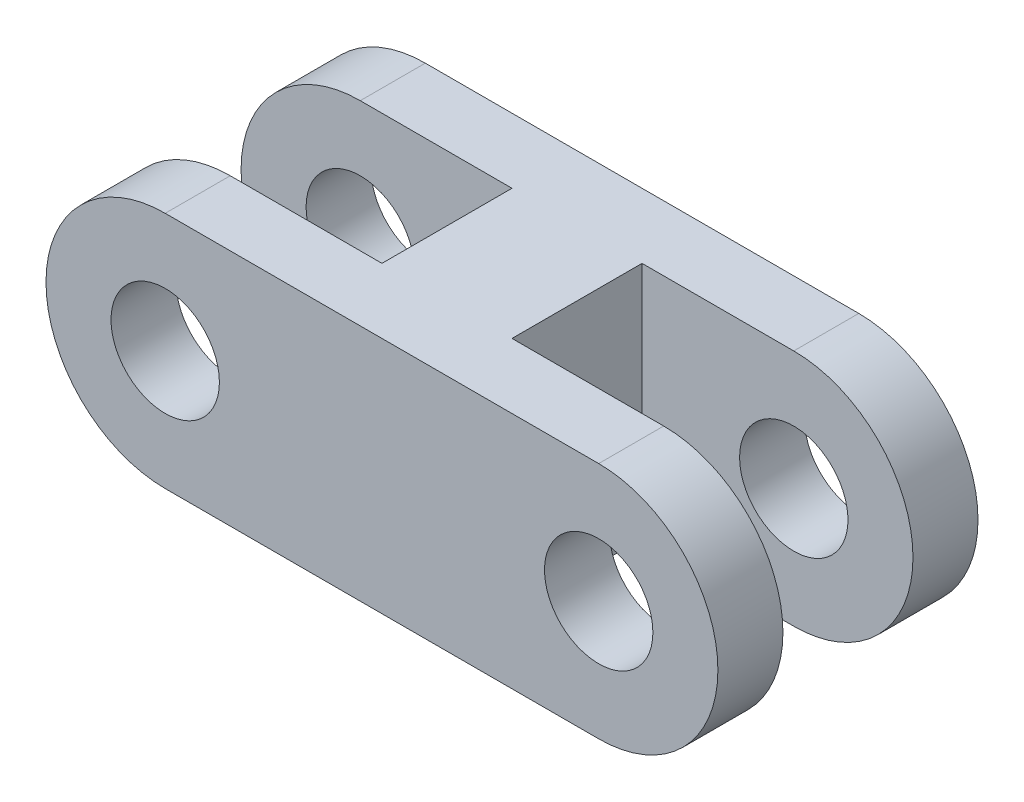
ISO-10303-21;
HEADER;
FILE_DESCRIPTION(('STEP AP214'),'2;1');
FILE_NAME('part.step','',(''),(''),'','','');
FILE_SCHEMA(('AUTOMOTIVE_DESIGN { 1 0 10303 214 1 1 1 1 }'));
ENDSEC;
DATA;
#1=APPLICATION_CONTEXT('core data for automotive mechanical design processes');
#2=APPLICATION_PROTOCOL_DEFINITION('international standard','automotive_design',2000,#1);
#3=PRODUCT_CONTEXT('',#1,'mechanical');
#4=PRODUCT('Part','Part','',(#3));
#5=PRODUCT_RELATED_PRODUCT_CATEGORY('part','',(#4));
#6=PRODUCT_DEFINITION_FORMATION('','',#4);
#7=PRODUCT_DEFINITION_CONTEXT('part definition',#1,'design');
#8=PRODUCT_DEFINITION('design','',#6,#7);
#9=PRODUCT_DEFINITION_SHAPE('','',#8);
#10=(LENGTH_UNIT() NAMED_UNIT(*) SI_UNIT(.MILLI.,.METRE.));
#11=(NAMED_UNIT(*) PLANE_ANGLE_UNIT() SI_UNIT($,.RADIAN.));
#12=(NAMED_UNIT(*) SI_UNIT($,.STERADIAN.) SOLID_ANGLE_UNIT());
#13=UNCERTAINTY_MEASURE_WITH_UNIT(LENGTH_MEASURE(1.E-05),#10,'distance_accuracy_value','');
#14=(GEOMETRIC_REPRESENTATION_CONTEXT(3) GLOBAL_UNCERTAINTY_ASSIGNED_CONTEXT((#13)) GLOBAL_UNIT_ASSIGNED_CONTEXT((#10,
#11,#12)) REPRESENTATION_CONTEXT('',''));
#15=CARTESIAN_POINT('',(0.,0.,0.));
#16=DIRECTION('',(0.,0.,1.));
#17=DIRECTION('',(1.,0.,0.));
#18=AXIS2_PLACEMENT_3D('',#15,#16,#17);
#19=CARTESIAN_POINT('',(0.,0.,12.));
#20=DIRECTION('',(0.,0.,1.));
#21=DIRECTION('',(1.,0.,0.));
#22=AXIS2_PLACEMENT_3D('',#19,#20,#21);
#23=PLANE('',#22);
#24=CARTESIAN_POINT('',(0.,0.,12.));
#25=DIRECTION('',(0.,0.,1.));
#26=DIRECTION('',(1.,0.,0.));
#27=AXIS2_PLACEMENT_3D('',#24,#25,#26);
#28=CIRCLE('',#27,2.5);
#29=CARTESIAN_POINT('',(2.5,0.,12.));
#30=VERTEX_POINT('',#29);
#31=EDGE_CURVE('E225',#30,#30,#28,.T.);
#32=ORIENTED_EDGE('',*,*,#31,.F.);
#33=EDGE_LOOP('',(#32));
#34=FACE_BOUND('',#33,.T.);
#35=CARTESIAN_POINT('',(0.,0.,12.));
#36=DIRECTION('',(0.,0.,1.));
#37=DIRECTION('',(1.,0.,0.));
#38=AXIS2_PLACEMENT_3D('',#35,#36,#37);
#39=CIRCLE('',#38,5.5);
#40=CARTESIAN_POINT('',(0.,5.5,12.));
#41=VERTEX_POINT('',#40);
#42=CARTESIAN_POINT('',(0.,-5.5,12.));
#43=VERTEX_POINT('',#42);
#44=EDGE_CURVE('E189',#41,#43,#39,.T.);
#45=ORIENTED_EDGE('',*,*,#44,.T.);
#46=DIRECTION('',(1.,0.,0.));
#47=VECTOR('',#46,1.);
#48=CARTESIAN_POINT('',(0.,-5.5,12.));
#49=LINE('',#48,#47);
#50=CARTESIAN_POINT('',(20.,-5.5,12.));
#51=VERTEX_POINT('',#50);
#52=EDGE_CURVE('E192',#43,#51,#49,.T.);
#53=ORIENTED_EDGE('',*,*,#52,.T.);
#54=CARTESIAN_POINT('',(20.,0.,12.));
#55=DIRECTION('',(0.,0.,1.));
#56=DIRECTION('',(1.,0.,0.));
#57=AXIS2_PLACEMENT_3D('',#54,#55,#56);
#58=CIRCLE('',#57,5.5);
#59=CARTESIAN_POINT('',(20.,5.5,12.));
#60=VERTEX_POINT('',#59);
#61=EDGE_CURVE('E195',#51,#60,#58,.T.);
#62=ORIENTED_EDGE('',*,*,#61,.T.);
#63=DIRECTION('',(-1.,0.,0.));
#64=VECTOR('',#63,1.);
#65=CARTESIAN_POINT('',(0.,5.5,12.));
#66=LINE('',#65,#64);
#67=EDGE_CURVE('E197',#60,#41,#66,.T.);
#68=ORIENTED_EDGE('',*,*,#67,.T.);
#69=EDGE_LOOP('',(#45,#53,#62,#68));
#70=FACE_BOUND('',#69,.T.);
#71=CARTESIAN_POINT('',(20.,0.,12.));
#72=DIRECTION('',(0.,0.,1.));
#73=DIRECTION('',(1.,0.,0.));
#74=AXIS2_PLACEMENT_3D('',#71,#72,#73);
#75=CIRCLE('',#74,2.5);
#76=CARTESIAN_POINT('',(22.5,0.,12.));
#77=VERTEX_POINT('',#76);
#78=EDGE_CURVE('E242',#77,#77,#75,.T.);
#79=ORIENTED_EDGE('',*,*,#78,.F.);
#80=EDGE_LOOP('',(#79));
#81=FACE_BOUND('',#80,.T.);
#82=ADVANCED_FACE('F39',(#34,#70,#81),#23,.T.);
#83=CARTESIAN_POINT('',(0.,0.,0.));
#84=DIRECTION('',(0.,0.,1.));
#85=DIRECTION('',(1.,0.,0.));
#86=AXIS2_PLACEMENT_3D('',#83,#84,#85);
#87=PLANE('',#86);
#88=CARTESIAN_POINT('',(0.,0.,0.));
#89=DIRECTION('',(0.,0.,1.));
#90=DIRECTION('',(1.,0.,0.));
#91=AXIS2_PLACEMENT_3D('',#88,#89,#90);
#92=CIRCLE('',#91,2.5);
#93=CARTESIAN_POINT('',(2.5,0.,0.));
#94=VERTEX_POINT('',#93);
#95=EDGE_CURVE('E230',#94,#94,#92,.T.);
#96=ORIENTED_EDGE('',*,*,#95,.T.);
#97=EDGE_LOOP('',(#96));
#98=FACE_BOUND('',#97,.T.);
#99=CARTESIAN_POINT('',(0.,0.,0.));
#100=DIRECTION('',(0.,0.,1.));
#101=DIRECTION('',(1.,0.,0.));
#102=AXIS2_PLACEMENT_3D('',#99,#100,#101);
#103=CIRCLE('',#102,5.5);
#104=CARTESIAN_POINT('',(0.,5.5,0.));
#105=VERTEX_POINT('',#104);
#106=CARTESIAN_POINT('',(0.,-5.5,0.));
#107=VERTEX_POINT('',#106);
#108=EDGE_CURVE('E188',#105,#107,#103,.T.);
#109=ORIENTED_EDGE('',*,*,#108,.F.);
#110=DIRECTION('',(-1.,0.,0.));
#111=VECTOR('',#110,1.);
#112=CARTESIAN_POINT('',(0.,5.5,0.));
#113=LINE('',#112,#111);
#114=CARTESIAN_POINT('',(20.,5.5,0.));
#115=VERTEX_POINT('',#114);
#116=EDGE_CURVE('E193',#115,#105,#113,.T.);
#117=ORIENTED_EDGE('',*,*,#116,.F.);
#118=CARTESIAN_POINT('',(20.,0.,0.));
#119=DIRECTION('',(0.,0.,1.));
#120=DIRECTION('',(1.,0.,0.));
#121=AXIS2_PLACEMENT_3D('',#118,#119,#120);
#122=CIRCLE('',#121,5.5);
#123=CARTESIAN_POINT('',(20.,-5.5,0.));
#124=VERTEX_POINT('',#123);
#125=EDGE_CURVE('E204',#124,#115,#122,.T.);
#126=ORIENTED_EDGE('',*,*,#125,.F.);
#127=DIRECTION('',(1.,0.,0.));
#128=VECTOR('',#127,1.);
#129=CARTESIAN_POINT('',(0.,-5.5,0.));
#130=LINE('',#129,#128);
#131=EDGE_CURVE('E202',#107,#124,#130,.T.);
#132=ORIENTED_EDGE('',*,*,#131,.F.);
#133=EDGE_LOOP('',(#109,#117,#126,#132));
#134=FACE_BOUND('',#133,.T.);
#135=CARTESIAN_POINT('',(20.,0.,0.));
#136=DIRECTION('',(0.,0.,1.));
#137=DIRECTION('',(1.,0.,0.));
#138=AXIS2_PLACEMENT_3D('',#135,#136,#137);
#139=CIRCLE('',#138,2.5);
#140=CARTESIAN_POINT('',(22.5,0.,0.));
#141=VERTEX_POINT('',#140);
#142=EDGE_CURVE('E239',#141,#141,#139,.T.);
#143=ORIENTED_EDGE('',*,*,#142,.T.);
#144=EDGE_LOOP('',(#143));
#145=FACE_BOUND('',#144,.T.);
#146=ADVANCED_FACE('F261',(#98,#134,#145),#87,.F.);
#147=CARTESIAN_POINT('',(25.5,-5.5,9.));
#148=DIRECTION('',(0.,0.,1.));
#149=DIRECTION('',(1.,0.,0.));
#150=AXIS2_PLACEMENT_3D('',#147,#148,#149);
#151=PLANE('',#150);
#152=CARTESIAN_POINT('',(20.,0.,9.));
#153=DIRECTION('',(0.,0.,1.));
#154=DIRECTION('',(1.,0.,0.));
#155=AXIS2_PLACEMENT_3D('',#152,#153,#154);
#156=CIRCLE('',#155,5.5);
#157=CARTESIAN_POINT('',(20.,-5.5,9.));
#158=VERTEX_POINT('',#157);
#159=CARTESIAN_POINT('',(20.,5.5,9.));
#160=VERTEX_POINT('',#159);
#161=EDGE_CURVE('E163',#158,#160,#156,.T.);
#162=ORIENTED_EDGE('',*,*,#161,.F.);
#163=DIRECTION('',(1.,0.,0.));
#164=VECTOR('',#163,1.);
#165=CARTESIAN_POINT('',(25.5,-5.5,9.));
#166=LINE('',#165,#164);
#167=CARTESIAN_POINT('',(13.,-5.5,9.));
#168=VERTEX_POINT('',#167);
#169=EDGE_CURVE('E138',#168,#158,#166,.T.);
#170=ORIENTED_EDGE('',*,*,#169,.F.);
#171=DIRECTION('',(0.,1.,0.));
#172=VECTOR('',#171,1.);
#173=CARTESIAN_POINT('',(13.,-5.5,9.));
#174=LINE('',#173,#172);
#175=CARTESIAN_POINT('',(13.,5.5,9.));
#176=VERTEX_POINT('',#175);
#177=EDGE_CURVE('E137',#168,#176,#174,.T.);
#178=ORIENTED_EDGE('',*,*,#177,.T.);
#179=DIRECTION('',(1.,0.,0.));
#180=VECTOR('',#179,1.);
#181=CARTESIAN_POINT('',(25.5,5.5,9.));
#182=LINE('',#181,#180);
#183=EDGE_CURVE('E150',#176,#160,#182,.T.);
#184=ORIENTED_EDGE('',*,*,#183,.T.);
#185=EDGE_LOOP('',(#162,#170,#178,#184));
#186=FACE_BOUND('',#185,.T.);
#187=CARTESIAN_POINT('',(20.,0.,9.));
#188=DIRECTION('',(0.,0.,1.));
#189=DIRECTION('',(1.,0.,0.));
#190=AXIS2_PLACEMENT_3D('',#187,#188,#189);
#191=CIRCLE('',#190,2.5);
#192=CARTESIAN_POINT('',(22.5,0.,9.));
#193=VERTEX_POINT('',#192);
#194=EDGE_CURVE('E235',#193,#193,#191,.F.);
#195=ORIENTED_EDGE('',*,*,#194,.F.);
#196=EDGE_LOOP('',(#195));
#197=FACE_BOUND('',#196,.T.);
#198=ADVANCED_FACE('F252',(#186,#197),#151,.F.);
#199=CARTESIAN_POINT('',(25.5,-5.5,3.));
#200=DIRECTION('',(0.,0.,-1.));
#201=DIRECTION('',(-1.,0.,0.));
#202=AXIS2_PLACEMENT_3D('',#199,#200,#201);
#203=PLANE('',#202);
#204=DIRECTION('',(1.,0.,0.));
#205=VECTOR('',#204,1.);
#206=CARTESIAN_POINT('',(0.,5.5,3.00000000000001));
#207=LINE('',#206,#205);
#208=CARTESIAN_POINT('',(13.,5.5,3.));
#209=VERTEX_POINT('',#208);
#210=CARTESIAN_POINT('',(20.,5.5,3.));
#211=VERTEX_POINT('',#210);
#212=EDGE_CURVE('E11',#209,#211,#207,.T.);
#213=ORIENTED_EDGE('',*,*,#212,.F.);
#214=DIRECTION('',(0.,1.,0.));
#215=VECTOR('',#214,1.);
#216=CARTESIAN_POINT('',(13.,-5.5,3.));
#217=LINE('',#216,#215);
#218=CARTESIAN_POINT('',(13.,-5.5,3.));
#219=VERTEX_POINT('',#218);
#220=EDGE_CURVE('E127',#219,#209,#217,.T.);
#221=ORIENTED_EDGE('',*,*,#220,.F.);
#222=DIRECTION('',(-1.,0.,0.));
#223=VECTOR('',#222,1.);
#224=CARTESIAN_POINT('',(25.5,-5.5,3.));
#225=LINE('',#224,#223);
#226=CARTESIAN_POINT('',(20.,-5.5,3.));
#227=VERTEX_POINT('',#226);
#228=EDGE_CURVE('E132',#227,#219,#225,.T.);
#229=ORIENTED_EDGE('',*,*,#228,.F.);
#230=CARTESIAN_POINT('',(20.,0.,3.));
#231=DIRECTION('',(0.,0.,-1.));
#232=DIRECTION('',(-1.,0.,0.));
#233=AXIS2_PLACEMENT_3D('',#230,#231,#232);
#234=CIRCLE('',#233,5.5);
#235=EDGE_CURVE('E56',#211,#227,#234,.T.);
#236=ORIENTED_EDGE('',*,*,#235,.F.);
#237=EDGE_LOOP('',(#213,#221,#229,#236));
#238=FACE_BOUND('',#237,.T.);
#239=CARTESIAN_POINT('',(20.,0.,3.));
#240=DIRECTION('',(0.,0.,-1.));
#241=DIRECTION('',(-1.,0.,0.));
#242=AXIS2_PLACEMENT_3D('',#239,#240,#241);
#243=CIRCLE('',#242,2.5);
#244=CARTESIAN_POINT('',(17.5,0.,3.));
#245=VERTEX_POINT('',#244);
#246=EDGE_CURVE('E43',#245,#245,#243,.F.);
#247=ORIENTED_EDGE('',*,*,#246,.F.);
#248=EDGE_LOOP('',(#247));
#249=FACE_BOUND('',#248,.T.);
#250=ADVANCED_FACE('F129',(#238,#249),#203,.F.);
#251=CARTESIAN_POINT('',(-5.49999999999999,-5.5,3.));
#252=DIRECTION('',(0.,0.,-1.));
#253=DIRECTION('',(-1.,0.,0.));
#254=AXIS2_PLACEMENT_3D('',#251,#252,#253);
#255=PLANE('',#254);
#256=CARTESIAN_POINT('',(0.,0.,3.));
#257=DIRECTION('',(0.,0.,-1.));
#258=DIRECTION('',(-1.,0.,0.));
#259=AXIS2_PLACEMENT_3D('',#256,#257,#258);
#260=CIRCLE('',#259,5.5);
#261=CARTESIAN_POINT('',(0.,-5.5,3.));
#262=VERTEX_POINT('',#261);
#263=CARTESIAN_POINT('',(0.,5.5,3.));
#264=VERTEX_POINT('',#263);
#265=EDGE_CURVE('E186',#262,#264,#260,.T.);
#266=ORIENTED_EDGE('',*,*,#265,.F.);
#267=DIRECTION('',(-1.,0.,0.));
#268=VECTOR('',#267,1.);
#269=CARTESIAN_POINT('',(-5.49999999999999,-5.5,3.));
#270=LINE('',#269,#268);
#271=CARTESIAN_POINT('',(7.,-5.5,3.));
#272=VERTEX_POINT('',#271);
#273=EDGE_CURVE('E173',#272,#262,#270,.T.);
#274=ORIENTED_EDGE('',*,*,#273,.F.);
#275=DIRECTION('',(0.,1.,0.));
#276=VECTOR('',#275,1.);
#277=CARTESIAN_POINT('',(7.,-5.5,3.));
#278=LINE('',#277,#276);
#279=CARTESIAN_POINT('',(7.,5.5,3.));
#280=VERTEX_POINT('',#279);
#281=EDGE_CURVE('E181',#272,#280,#278,.T.);
#282=ORIENTED_EDGE('',*,*,#281,.T.);
#283=DIRECTION('',(-1.,0.,0.));
#284=VECTOR('',#283,1.);
#285=CARTESIAN_POINT('',(-5.49999999999999,5.5,3.));
#286=LINE('',#285,#284);
#287=EDGE_CURVE('E170',#280,#264,#286,.T.);
#288=ORIENTED_EDGE('',*,*,#287,.T.);
#289=EDGE_LOOP('',(#266,#274,#282,#288));
#290=FACE_BOUND('',#289,.T.);
#291=CARTESIAN_POINT('',(0.,0.,3.));
#292=DIRECTION('',(0.,0.,-1.));
#293=DIRECTION('',(-1.,0.,0.));
#294=AXIS2_PLACEMENT_3D('',#291,#292,#293);
#295=CIRCLE('',#294,2.5);
#296=CARTESIAN_POINT('',(-2.5,0.,3.));
#297=VERTEX_POINT('',#296);
#298=EDGE_CURVE('E156',#297,#297,#295,.F.);
#299=ORIENTED_EDGE('',*,*,#298,.F.);
#300=EDGE_LOOP('',(#299));
#301=FACE_BOUND('',#300,.T.);
#302=ADVANCED_FACE('F251',(#290,#301),#255,.F.);
#303=CARTESIAN_POINT('',(-5.49999999999999,-5.5,9.));
#304=DIRECTION('',(0.,0.,1.));
#305=DIRECTION('',(1.,0.,0.));
#306=AXIS2_PLACEMENT_3D('',#303,#304,#305);
#307=PLANE('',#306);
#308=DIRECTION('',(-1.,0.,0.));
#309=VECTOR('',#308,1.);
#310=CARTESIAN_POINT('',(0.,5.5,9.));
#311=LINE('',#310,#309);
#312=CARTESIAN_POINT('',(7.,5.5,9.));
#313=VERTEX_POINT('',#312);
#314=CARTESIAN_POINT('',(0.,5.5,9.));
#315=VERTEX_POINT('',#314);
#316=EDGE_CURVE('E48',#313,#315,#311,.T.);
#317=ORIENTED_EDGE('',*,*,#316,.F.);
#318=DIRECTION('',(0.,1.,0.));
#319=VECTOR('',#318,1.);
#320=CARTESIAN_POINT('',(7.,-5.5,9.));
#321=LINE('',#320,#319);
#322=CARTESIAN_POINT('',(7.,-5.5,9.));
#323=VERTEX_POINT('',#322);
#324=EDGE_CURVE('E176',#323,#313,#321,.T.);
#325=ORIENTED_EDGE('',*,*,#324,.F.);
#326=DIRECTION('',(1.,0.,0.));
#327=VECTOR('',#326,1.);
#328=CARTESIAN_POINT('',(-5.49999999999999,-5.5,9.));
#329=LINE('',#328,#327);
#330=CARTESIAN_POINT('',(0.,-5.5,9.));
#331=VERTEX_POINT('',#330);
#332=EDGE_CURVE('E166',#331,#323,#329,.T.);
#333=ORIENTED_EDGE('',*,*,#332,.F.);
#334=CARTESIAN_POINT('',(0.,0.,9.));
#335=DIRECTION('',(0.,0.,1.));
#336=DIRECTION('',(1.,0.,0.));
#337=AXIS2_PLACEMENT_3D('',#334,#335,#336);
#338=CIRCLE('',#337,5.5);
#339=EDGE_CURVE('E63',#315,#331,#338,.T.);
#340=ORIENTED_EDGE('',*,*,#339,.F.);
#341=EDGE_LOOP('',(#317,#325,#333,#340));
#342=FACE_BOUND('',#341,.T.);
#343=CARTESIAN_POINT('',(0.,0.,9.));
#344=DIRECTION('',(0.,0.,1.));
#345=DIRECTION('',(1.,0.,0.));
#346=AXIS2_PLACEMENT_3D('',#343,#344,#345);
#347=CIRCLE('',#346,2.5);
#348=CARTESIAN_POINT('',(2.5,0.,9.));
#349=VERTEX_POINT('',#348);
#350=EDGE_CURVE('E223',#349,#349,#347,.F.);
#351=ORIENTED_EDGE('',*,*,#350,.F.);
#352=EDGE_LOOP('',(#351));
#353=FACE_BOUND('',#352,.T.);
#354=ADVANCED_FACE('F258',(#342,#353),#307,.F.);
#355=CARTESIAN_POINT('',(20.,0.,12.));
#356=DIRECTION('',(0.,0.,-1.));
#357=DIRECTION('',(-1.,0.,0.));
#358=AXIS2_PLACEMENT_3D('',#355,#356,#357);
#359=CYLINDRICAL_SURFACE('',#358,5.5);
#360=ORIENTED_EDGE('',*,*,#161,.T.);
#361=DIRECTION('',(0.,0.,-1.));
#362=VECTOR('',#361,1.);
#363=CARTESIAN_POINT('',(20.,5.5,12.));
#364=LINE('',#363,#362);
#365=EDGE_CURVE('E213',#60,#160,#364,.T.);
#366=ORIENTED_EDGE('',*,*,#365,.F.);
#367=ORIENTED_EDGE('',*,*,#61,.F.);
#368=DIRECTION('',(0.,0.,-1.));
#369=VECTOR('',#368,1.);
#370=CARTESIAN_POINT('',(20.,-5.5,12.));
#371=LINE('',#370,#369);
#372=EDGE_CURVE('E216',#51,#158,#371,.T.);
#373=ORIENTED_EDGE('',*,*,#372,.T.);
#374=EDGE_LOOP('',(#360,#366,#367,#373));
#375=FACE_BOUND('',#374,.T.);
#376=ADVANCED_FACE('F286',(#375),#359,.T.);
#377=CARTESIAN_POINT('',(0.,0.,12.));
#378=DIRECTION('',(0.,0.,-1.));
#379=DIRECTION('',(-1.,0.,0.));
#380=AXIS2_PLACEMENT_3D('',#377,#378,#379);
#381=CYLINDRICAL_SURFACE('',#380,5.5);
#382=ORIENTED_EDGE('',*,*,#265,.T.);
#383=DIRECTION('',(0.,0.,-1.));
#384=VECTOR('',#383,1.);
#385=CARTESIAN_POINT('',(0.,5.5,12.));
#386=LINE('',#385,#384);
#387=EDGE_CURVE('E199',#264,#105,#386,.T.);
#388=ORIENTED_EDGE('',*,*,#387,.T.);
#389=ORIENTED_EDGE('',*,*,#108,.T.);
#390=DIRECTION('',(0.,0.,-1.));
#391=VECTOR('',#390,1.);
#392=CARTESIAN_POINT('',(0.,-5.5,12.));
#393=LINE('',#392,#391);
#394=EDGE_CURVE('E219',#262,#107,#393,.T.);
#395=ORIENTED_EDGE('',*,*,#394,.F.);
#396=EDGE_LOOP('',(#382,#388,#389,#395));
#397=FACE_BOUND('',#396,.T.);
#398=ADVANCED_FACE('F291',(#397),#381,.T.);
#399=EDGE_CURVE('E209',#41,#315,#386,.T.);
#400=ORIENTED_EDGE('',*,*,#399,.T.);
#401=ORIENTED_EDGE('',*,*,#339,.T.);
#402=EDGE_CURVE('E220',#43,#331,#393,.T.);
#403=ORIENTED_EDGE('',*,*,#402,.F.);
#404=ORIENTED_EDGE('',*,*,#44,.F.);
#405=EDGE_LOOP('',(#400,#401,#403,#404));
#406=FACE_BOUND('',#405,.T.);
#407=ADVANCED_FACE('F41',(#406),#381,.T.);
#408=CARTESIAN_POINT('',(0.,-5.5,12.));
#409=DIRECTION('',(0.,1.,0.));
#410=DIRECTION('',(0.,0.,1.));
#411=AXIS2_PLACEMENT_3D('',#408,#409,#410);
#412=PLANE('',#411);
#413=DIRECTION('',(0.,0.,1.));
#414=VECTOR('',#413,1.);
#415=CARTESIAN_POINT('',(13.,-5.5,3.));
#416=LINE('',#415,#414);
#417=EDGE_CURVE('E141',#219,#168,#416,.T.);
#418=ORIENTED_EDGE('',*,*,#417,.T.);
#419=ORIENTED_EDGE('',*,*,#169,.T.);
#420=ORIENTED_EDGE('',*,*,#372,.F.);
#421=ORIENTED_EDGE('',*,*,#52,.F.);
#422=ORIENTED_EDGE('',*,*,#402,.T.);
#423=ORIENTED_EDGE('',*,*,#332,.T.);
#424=DIRECTION('',(0.,0.,-1.));
#425=VECTOR('',#424,1.);
#426=CARTESIAN_POINT('',(7.,-5.5,3.));
#427=LINE('',#426,#425);
#428=EDGE_CURVE('E169',#323,#272,#427,.T.);
#429=ORIENTED_EDGE('',*,*,#428,.T.);
#430=ORIENTED_EDGE('',*,*,#273,.T.);
#431=ORIENTED_EDGE('',*,*,#394,.T.);
#432=ORIENTED_EDGE('',*,*,#131,.T.);
#433=EDGE_CURVE('E149',#227,#124,#371,.T.);
#434=ORIENTED_EDGE('',*,*,#433,.F.);
#435=ORIENTED_EDGE('',*,*,#228,.T.);
#436=EDGE_LOOP('',(#418,#419,#420,#421,#422,#423,#429,#430,#431,#432,#434,#435));
#437=FACE_BOUND('',#436,.T.);
#438=ADVANCED_FACE('F147',(#437),#412,.F.);
#439=EDGE_CURVE('E212',#211,#115,#364,.T.);
#440=ORIENTED_EDGE('',*,*,#439,.F.);
#441=ORIENTED_EDGE('',*,*,#235,.T.);
#442=ORIENTED_EDGE('',*,*,#433,.T.);
#443=ORIENTED_EDGE('',*,*,#125,.T.);
#444=EDGE_LOOP('',(#440,#441,#442,#443));
#445=FACE_BOUND('',#444,.T.);
#446=ADVANCED_FACE('F282',(#445),#359,.T.);
#447=CARTESIAN_POINT('',(0.,5.5,12.));
#448=DIRECTION('',(0.,-1.,0.));
#449=DIRECTION('',(0.,0.,-1.));
#450=AXIS2_PLACEMENT_3D('',#447,#448,#449);
#451=PLANE('',#450);
#452=ORIENTED_EDGE('',*,*,#365,.T.);
#453=ORIENTED_EDGE('',*,*,#183,.F.);
#454=DIRECTION('',(0.,0.,1.));
#455=VECTOR('',#454,1.);
#456=CARTESIAN_POINT('',(13.,5.5,3.));
#457=LINE('',#456,#455);
#458=EDGE_CURVE('E153',#209,#176,#457,.T.);
#459=ORIENTED_EDGE('',*,*,#458,.F.);
#460=ORIENTED_EDGE('',*,*,#212,.T.);
#461=ORIENTED_EDGE('',*,*,#439,.T.);
#462=ORIENTED_EDGE('',*,*,#116,.T.);
#463=ORIENTED_EDGE('',*,*,#387,.F.);
#464=ORIENTED_EDGE('',*,*,#287,.F.);
#465=DIRECTION('',(0.,0.,-1.));
#466=VECTOR('',#465,1.);
#467=CARTESIAN_POINT('',(7.,5.5,3.));
#468=LINE('',#467,#466);
#469=EDGE_CURVE('E165',#313,#280,#468,.T.);
#470=ORIENTED_EDGE('',*,*,#469,.F.);
#471=ORIENTED_EDGE('',*,*,#316,.T.);
#472=ORIENTED_EDGE('',*,*,#399,.F.);
#473=ORIENTED_EDGE('',*,*,#67,.F.);
#474=EDGE_LOOP('',(#452,#453,#459,#460,#461,#462,#463,#464,#470,#471,#472,#473));
#475=FACE_BOUND('',#474,.T.);
#476=ADVANCED_FACE('F278',(#475),#451,.F.);
#477=CARTESIAN_POINT('',(7.,-5.5,3.));
#478=DIRECTION('',(1.,0.,0.));
#479=DIRECTION('',(0.,0.,-1.));
#480=AXIS2_PLACEMENT_3D('',#477,#478,#479);
#481=PLANE('',#480);
#482=ORIENTED_EDGE('',*,*,#469,.T.);
#483=ORIENTED_EDGE('',*,*,#281,.F.);
#484=ORIENTED_EDGE('',*,*,#428,.F.);
#485=ORIENTED_EDGE('',*,*,#324,.T.);
#486=EDGE_LOOP('',(#482,#483,#484,#485));
#487=FACE_BOUND('',#486,.T.);
#488=ADVANCED_FACE('F281',(#487),#481,.F.);
#489=CARTESIAN_POINT('',(13.,-5.5,3.));
#490=DIRECTION('',(-1.,0.,0.));
#491=DIRECTION('',(0.,0.,1.));
#492=AXIS2_PLACEMENT_3D('',#489,#490,#491);
#493=PLANE('',#492);
#494=ORIENTED_EDGE('',*,*,#458,.T.);
#495=ORIENTED_EDGE('',*,*,#177,.F.);
#496=ORIENTED_EDGE('',*,*,#417,.F.);
#497=ORIENTED_EDGE('',*,*,#220,.T.);
#498=EDGE_LOOP('',(#494,#495,#496,#497));
#499=FACE_BOUND('',#498,.T.);
#500=ADVANCED_FACE('F142',(#499),#493,.F.);
#501=CARTESIAN_POINT('',(0.,0.,12.));
#502=DIRECTION('',(0.,0.,-1.));
#503=DIRECTION('',(-1.,0.,0.));
#504=AXIS2_PLACEMENT_3D('',#501,#502,#503);
#505=CYLINDRICAL_SURFACE('',#504,2.5);
#506=ORIENTED_EDGE('',*,*,#31,.T.);
#507=EDGE_LOOP('',(#506));
#508=FACE_BOUND('',#507,.T.);
#509=ORIENTED_EDGE('',*,*,#350,.T.);
#510=EDGE_LOOP('',(#509));
#511=FACE_BOUND('',#510,.T.);
#512=ADVANCED_FACE('F326',(#508,#511),#505,.F.);
#513=ORIENTED_EDGE('',*,*,#95,.F.);
#514=EDGE_LOOP('',(#513));
#515=FACE_BOUND('',#514,.T.);
#516=ORIENTED_EDGE('',*,*,#298,.T.);
#517=EDGE_LOOP('',(#516));
#518=FACE_BOUND('',#517,.T.);
#519=ADVANCED_FACE('F322',(#515,#518),#505,.F.);
#520=CARTESIAN_POINT('',(20.,0.,12.));
#521=DIRECTION('',(0.,0.,-1.));
#522=DIRECTION('',(-1.,0.,0.));
#523=AXIS2_PLACEMENT_3D('',#520,#521,#522);
#524=CYLINDRICAL_SURFACE('',#523,2.5);
#525=ORIENTED_EDGE('',*,*,#142,.F.);
#526=EDGE_LOOP('',(#525));
#527=FACE_BOUND('',#526,.T.);
#528=ORIENTED_EDGE('',*,*,#246,.T.);
#529=EDGE_LOOP('',(#528));
#530=FACE_BOUND('',#529,.T.);
#531=ADVANCED_FACE('F249',(#527,#530),#524,.F.);
#532=ORIENTED_EDGE('',*,*,#78,.T.);
#533=EDGE_LOOP('',(#532));
#534=FACE_BOUND('',#533,.T.);
#535=ORIENTED_EDGE('',*,*,#194,.T.);
#536=EDGE_LOOP('',(#535));
#537=FACE_BOUND('',#536,.T.);
#538=ADVANCED_FACE('F316',(#534,#537),#524,.F.);
#539=CLOSED_SHELL('',(#82,#146,#198,#250,#302,#354,#376,#398,#407,#438,#446,#476,#488,#500,#512,
#519,#531,#538));
#540=MANIFOLD_SOLID_BREP('B2',#539);
#541=ADVANCED_BREP_SHAPE_REPRESENTATION('',(#18,#540),#14);
#542=SHAPE_DEFINITION_REPRESENTATION(#9,#541);
ENDSEC;
END-ISO-10303-21;
